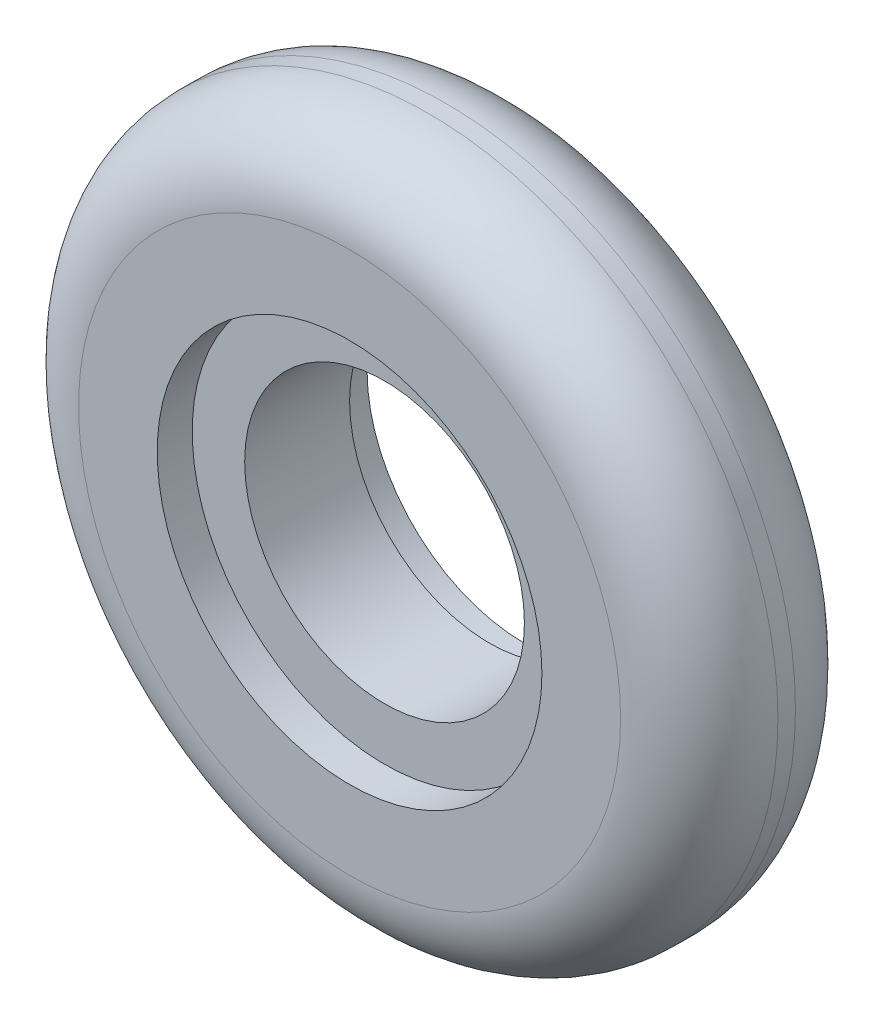
ISO-10303-21;
HEADER;
FILE_DESCRIPTION(('STEP AP214'),'2;1');
FILE_NAME('part.step','',(''),(''),'','','');
FILE_SCHEMA(('AUTOMOTIVE_DESIGN { 1 0 10303 214 1 1 1 1 }'));
ENDSEC;
DATA;
#1=APPLICATION_CONTEXT('core data for automotive mechanical design processes');
#2=APPLICATION_PROTOCOL_DEFINITION('international standard','automotive_design',2000,#1);
#3=PRODUCT_CONTEXT('',#1,'mechanical');
#4=PRODUCT('Part','Part','',(#3));
#5=PRODUCT_RELATED_PRODUCT_CATEGORY('part','',(#4));
#6=PRODUCT_DEFINITION_FORMATION('','',#4);
#7=PRODUCT_DEFINITION_CONTEXT('part definition',#1,'design');
#8=PRODUCT_DEFINITION('design','',#6,#7);
#9=PRODUCT_DEFINITION_SHAPE('','',#8);
#10=(LENGTH_UNIT() NAMED_UNIT(*) SI_UNIT(.MILLI.,.METRE.));
#11=(NAMED_UNIT(*) PLANE_ANGLE_UNIT() SI_UNIT($,.RADIAN.));
#12=(NAMED_UNIT(*) SI_UNIT($,.STERADIAN.) SOLID_ANGLE_UNIT());
#13=UNCERTAINTY_MEASURE_WITH_UNIT(LENGTH_MEASURE(1.E-05),#10,'distance_accuracy_value','');
#14=(GEOMETRIC_REPRESENTATION_CONTEXT(3) GLOBAL_UNCERTAINTY_ASSIGNED_CONTEXT((#13)) GLOBAL_UNIT_ASSIGNED_CONTEXT((#10,
#11,#12)) REPRESENTATION_CONTEXT('',''));
#15=CARTESIAN_POINT('',(0.,0.,0.));
#16=DIRECTION('',(0.,0.,1.));
#17=DIRECTION('',(1.,0.,0.));
#18=AXIS2_PLACEMENT_3D('',#15,#16,#17);
#19=CARTESIAN_POINT('',(0.,0.,10.));
#20=DIRECTION('',(0.,0.,-1.));
#21=DIRECTION('',(-1.,0.,0.));
#22=AXIS2_PLACEMENT_3D('',#19,#20,#21);
#23=CYLINDRICAL_SURFACE('',#22,8.);
#24=CARTESIAN_POINT('',(0.,0.,2.));
#25=DIRECTION('',(0.,0.,-1.));
#26=DIRECTION('',(-1.,0.,0.));
#27=AXIS2_PLACEMENT_3D('',#24,#25,#26);
#28=CIRCLE('',#27,8.);
#29=CARTESIAN_POINT('',(-8.,0.,2.));
#30=VERTEX_POINT('',#29);
#31=EDGE_CURVE('E61',#30,#30,#28,.T.);
#32=ORIENTED_EDGE('',*,*,#31,.T.);
#33=EDGE_LOOP('',(#32));
#34=FACE_BOUND('',#33,.T.);
#35=CARTESIAN_POINT('',(0.,0.,8.));
#36=DIRECTION('',(0.,0.,1.));
#37=DIRECTION('',(1.,0.,0.));
#38=AXIS2_PLACEMENT_3D('',#35,#36,#37);
#39=CIRCLE('',#38,8.);
#40=CARTESIAN_POINT('',(8.,0.,8.));
#41=VERTEX_POINT('',#40);
#42=EDGE_CURVE('E47',#41,#41,#39,.T.);
#43=ORIENTED_EDGE('',*,*,#42,.T.);
#44=EDGE_LOOP('',(#43));
#45=FACE_BOUND('',#44,.T.);
#46=ADVANCED_FACE('F43',(#34,#45),#23,.F.);
#47=CARTESIAN_POINT('',(0.,0.,10.));
#48=DIRECTION('',(0.,0.,1.));
#49=DIRECTION('',(1.,0.,0.));
#50=AXIS2_PLACEMENT_3D('',#47,#48,#49);
#51=PLANE('',#50);
#52=CARTESIAN_POINT('',(0.,0.,10.));
#53=DIRECTION('',(0.,0.,1.));
#54=DIRECTION('',(1.,0.,0.));
#55=AXIS2_PLACEMENT_3D('',#52,#53,#54);
#56=CIRCLE('',#55,11.);
#57=CARTESIAN_POINT('',(11.,0.,10.));
#58=VERTEX_POINT('',#57);
#59=EDGE_CURVE('E81',#58,#58,#56,.T.);
#60=ORIENTED_EDGE('',*,*,#59,.F.);
#61=EDGE_LOOP('',(#60));
#62=FACE_BOUND('',#61,.T.);
#63=CARTESIAN_POINT('',(0.,0.,10.));
#64=DIRECTION('',(0.,0.,1.));
#65=DIRECTION('',(1.,0.,0.));
#66=AXIS2_PLACEMENT_3D('',#63,#64,#65);
#67=CIRCLE('',#66,15.5);
#68=CARTESIAN_POINT('',(15.5,0.,10.));
#69=VERTEX_POINT('',#68);
#70=EDGE_CURVE('E10',#69,#69,#67,.T.);
#71=ORIENTED_EDGE('',*,*,#70,.T.);
#72=EDGE_LOOP('',(#71));
#73=FACE_BOUND('',#72,.T.);
#74=ADVANCED_FACE('F103',(#62,#73),#51,.T.);
#75=CARTESIAN_POINT('',(0.,0.,0.));
#76=DIRECTION('',(0.,0.,1.));
#77=DIRECTION('',(1.,0.,0.));
#78=AXIS2_PLACEMENT_3D('',#75,#76,#77);
#79=PLANE('',#78);
#80=CARTESIAN_POINT('',(0.,0.,0.));
#81=DIRECTION('',(0.,0.,-1.));
#82=DIRECTION('',(-1.,0.,0.));
#83=AXIS2_PLACEMENT_3D('',#80,#81,#82);
#84=CIRCLE('',#83,9.);
#85=CARTESIAN_POINT('',(-9.,0.,0.));
#86=VERTEX_POINT('',#85);
#87=EDGE_CURVE('E73',#86,#86,#84,.T.);
#88=ORIENTED_EDGE('',*,*,#87,.F.);
#89=EDGE_LOOP('',(#88));
#90=FACE_BOUND('',#89,.T.);
#91=CARTESIAN_POINT('',(0.,0.,0.));
#92=DIRECTION('',(0.,0.,1.));
#93=DIRECTION('',(1.,0.,0.));
#94=AXIS2_PLACEMENT_3D('',#91,#92,#93);
#95=CIRCLE('',#94,15.5);
#96=CARTESIAN_POINT('',(15.5,0.,0.));
#97=VERTEX_POINT('',#96);
#98=EDGE_CURVE('E52',#97,#97,#95,.F.);
#99=ORIENTED_EDGE('',*,*,#98,.T.);
#100=EDGE_LOOP('',(#99));
#101=FACE_BOUND('',#100,.T.);
#102=ADVANCED_FACE('F99',(#90,#101),#79,.F.);
#103=CARTESIAN_POINT('',(0.,0.,10.));
#104=DIRECTION('',(0.,0.,-1.));
#105=DIRECTION('',(-1.,0.,0.));
#106=AXIS2_PLACEMENT_3D('',#103,#104,#105);
#107=CYLINDRICAL_SURFACE('',#106,20.);
#108=CARTESIAN_POINT('',(0.,0.,4.5));
#109=DIRECTION('',(0.,0.,1.));
#110=DIRECTION('',(1.,0.,0.));
#111=AXIS2_PLACEMENT_3D('',#108,#109,#110);
#112=CIRCLE('',#111,20.);
#113=CARTESIAN_POINT('',(20.,0.,4.5));
#114=VERTEX_POINT('',#113);
#115=EDGE_CURVE('E58',#114,#114,#112,.T.);
#116=ORIENTED_EDGE('',*,*,#115,.T.);
#117=EDGE_LOOP('',(#116));
#118=FACE_BOUND('',#117,.T.);
#119=CARTESIAN_POINT('',(0.,0.,5.5));
#120=DIRECTION('',(0.,0.,1.));
#121=DIRECTION('',(1.,0.,0.));
#122=AXIS2_PLACEMENT_3D('',#119,#120,#121);
#123=CIRCLE('',#122,20.);
#124=CARTESIAN_POINT('',(20.,0.,5.5));
#125=VERTEX_POINT('',#124);
#126=EDGE_CURVE('E64',#125,#125,#123,.F.);
#127=ORIENTED_EDGE('',*,*,#126,.T.);
#128=EDGE_LOOP('',(#127));
#129=FACE_BOUND('',#128,.T.);
#130=ADVANCED_FACE('F87',(#118,#129),#107,.T.);
#131=CARTESIAN_POINT('',(0.,0.,4.5));
#132=DIRECTION('',(0.,0.,1.));
#133=DIRECTION('',(1.,0.,0.));
#134=AXIS2_PLACEMENT_3D('',#131,#132,#133);
#135=TOROIDAL_SURFACE('',#134,15.5,4.5);
#136=ORIENTED_EDGE('',*,*,#98,.F.);
#137=EDGE_LOOP('',(#136));
#138=FACE_BOUND('',#137,.T.);
#139=ORIENTED_EDGE('',*,*,#115,.F.);
#140=EDGE_LOOP('',(#139));
#141=FACE_BOUND('',#140,.T.);
#142=ADVANCED_FACE('F90',(#138,#141),#135,.T.);
#143=CARTESIAN_POINT('',(0.,0.,5.5));
#144=DIRECTION('',(0.,0.,1.));
#145=DIRECTION('',(1.,0.,0.));
#146=AXIS2_PLACEMENT_3D('',#143,#144,#145);
#147=TOROIDAL_SURFACE('',#146,15.5,4.5);
#148=ORIENTED_EDGE('',*,*,#126,.F.);
#149=EDGE_LOOP('',(#148));
#150=FACE_BOUND('',#149,.T.);
#151=ORIENTED_EDGE('',*,*,#70,.F.);
#152=EDGE_LOOP('',(#151));
#153=FACE_BOUND('',#152,.T.);
#154=ADVANCED_FACE('F45',(#150,#153),#147,.T.);
#155=CARTESIAN_POINT('',(0.,0.,2.));
#156=DIRECTION('',(0.,0.,-1.));
#157=DIRECTION('',(-1.,0.,0.));
#158=AXIS2_PLACEMENT_3D('',#155,#156,#157);
#159=CYLINDRICAL_SURFACE('',#158,9.);
#160=CARTESIAN_POINT('',(0.,0.,2.));
#161=DIRECTION('',(0.,0.,-1.));
#162=DIRECTION('',(-1.,0.,0.));
#163=AXIS2_PLACEMENT_3D('',#160,#161,#162);
#164=CIRCLE('',#163,9.);
#165=CARTESIAN_POINT('',(-9.,0.,2.));
#166=VERTEX_POINT('',#165);
#167=EDGE_CURVE('E65',#166,#166,#164,.T.);
#168=ORIENTED_EDGE('',*,*,#167,.F.);
#169=EDGE_LOOP('',(#168));
#170=FACE_BOUND('',#169,.T.);
#171=ORIENTED_EDGE('',*,*,#87,.T.);
#172=EDGE_LOOP('',(#171));
#173=FACE_BOUND('',#172,.T.);
#174=ADVANCED_FACE('F97',(#170,#173),#159,.F.);
#175=CARTESIAN_POINT('',(0.,0.,2.));
#176=DIRECTION('',(0.,0.,-1.));
#177=DIRECTION('',(-1.,0.,0.));
#178=AXIS2_PLACEMENT_3D('',#175,#176,#177);
#179=PLANE('',#178);
#180=ORIENTED_EDGE('',*,*,#31,.F.);
#181=EDGE_LOOP('',(#180));
#182=FACE_BOUND('',#181,.T.);
#183=ORIENTED_EDGE('',*,*,#167,.T.);
#184=EDGE_LOOP('',(#183));
#185=FACE_BOUND('',#184,.T.);
#186=ADVANCED_FACE('F123',(#182,#185),#179,.T.);
#187=CARTESIAN_POINT('',(0.,0.,8.));
#188=DIRECTION('',(0.,0.,1.));
#189=DIRECTION('',(1.,0.,0.));
#190=AXIS2_PLACEMENT_3D('',#187,#188,#189);
#191=CYLINDRICAL_SURFACE('',#190,11.);
#192=CARTESIAN_POINT('',(0.,0.,8.));
#193=DIRECTION('',(0.,0.,1.));
#194=DIRECTION('',(1.,0.,0.));
#195=AXIS2_PLACEMENT_3D('',#192,#193,#194);
#196=CIRCLE('',#195,11.);
#197=CARTESIAN_POINT('',(11.,0.,8.));
#198=VERTEX_POINT('',#197);
#199=EDGE_CURVE('E145',#198,#198,#196,.T.);
#200=ORIENTED_EDGE('',*,*,#199,.F.);
#201=EDGE_LOOP('',(#200));
#202=FACE_BOUND('',#201,.T.);
#203=ORIENTED_EDGE('',*,*,#59,.T.);
#204=EDGE_LOOP('',(#203));
#205=FACE_BOUND('',#204,.T.);
#206=ADVANCED_FACE('F127',(#202,#205),#191,.F.);
#207=CARTESIAN_POINT('',(0.,0.,8.));
#208=DIRECTION('',(0.,0.,1.));
#209=DIRECTION('',(1.,0.,0.));
#210=AXIS2_PLACEMENT_3D('',#207,#208,#209);
#211=PLANE('',#210);
#212=ORIENTED_EDGE('',*,*,#42,.F.);
#213=EDGE_LOOP('',(#212));
#214=FACE_BOUND('',#213,.T.);
#215=ORIENTED_EDGE('',*,*,#199,.T.);
#216=EDGE_LOOP('',(#215));
#217=FACE_BOUND('',#216,.T.);
#218=ADVANCED_FACE('F132',(#214,#217),#211,.T.);
#219=CLOSED_SHELL('',(#46,#74,#102,#130,#142,#154,#174,#186,#206,#218));
#220=MANIFOLD_SOLID_BREP('B2',#219);
#221=ADVANCED_BREP_SHAPE_REPRESENTATION('',(#18,#220),#14);
#222=SHAPE_DEFINITION_REPRESENTATION(#9,#221);
ENDSEC;
END-ISO-10303-21;
